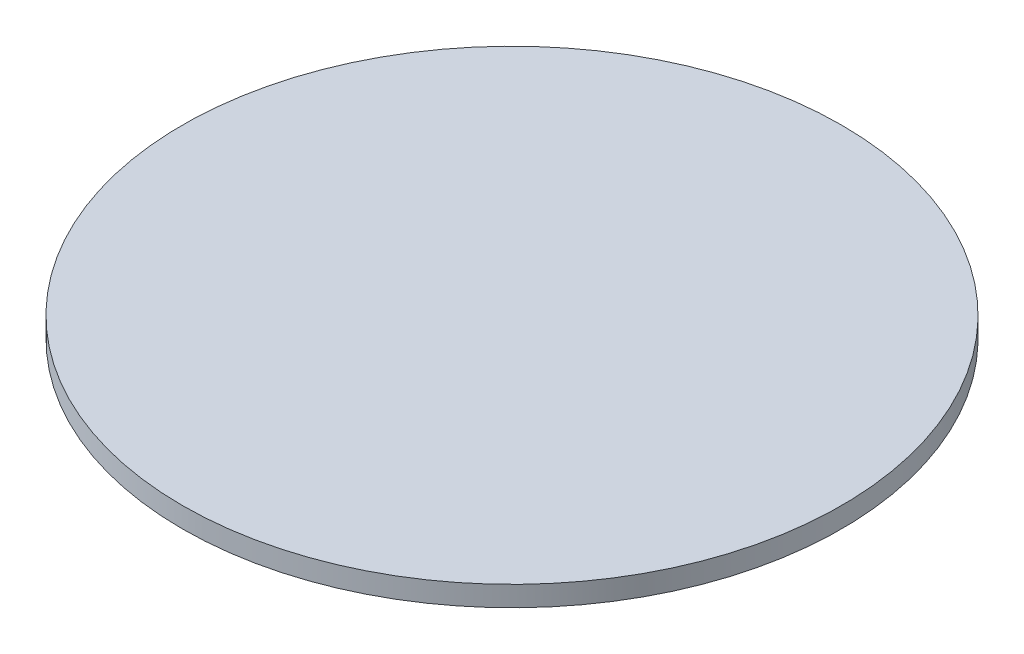
ISO-10303-21;
HEADER;
FILE_DESCRIPTION(('STEP AP214'),'2;1');
FILE_NAME('part.step','',(''),(''),'','','');
FILE_SCHEMA(('AUTOMOTIVE_DESIGN { 1 0 10303 214 1 1 1 1 }'));
ENDSEC;
DATA;
#1=APPLICATION_CONTEXT('core data for automotive mechanical design processes');
#2=APPLICATION_PROTOCOL_DEFINITION('international standard','automotive_design',2000,#1);
#3=PRODUCT_CONTEXT('',#1,'mechanical');
#4=PRODUCT('Part','Part','',(#3));
#5=PRODUCT_RELATED_PRODUCT_CATEGORY('part','',(#4));
#6=PRODUCT_DEFINITION_FORMATION('','',#4);
#7=PRODUCT_DEFINITION_CONTEXT('part definition',#1,'design');
#8=PRODUCT_DEFINITION('design','',#6,#7);
#9=PRODUCT_DEFINITION_SHAPE('','',#8);
#10=(LENGTH_UNIT() NAMED_UNIT(*) SI_UNIT(.MILLI.,.METRE.));
#11=(NAMED_UNIT(*) PLANE_ANGLE_UNIT() SI_UNIT($,.RADIAN.));
#12=(NAMED_UNIT(*) SI_UNIT($,.STERADIAN.) SOLID_ANGLE_UNIT());
#13=UNCERTAINTY_MEASURE_WITH_UNIT(LENGTH_MEASURE(1.E-05),#10,'distance_accuracy_value','');
#14=(GEOMETRIC_REPRESENTATION_CONTEXT(3) GLOBAL_UNCERTAINTY_ASSIGNED_CONTEXT((#13)) GLOBAL_UNIT_ASSIGNED_CONTEXT((#10,
#11,#12)) REPRESENTATION_CONTEXT('',''));
#15=CARTESIAN_POINT('',(0.,0.,0.));
#16=DIRECTION('',(0.,0.,1.));
#17=DIRECTION('',(1.,0.,0.));
#18=AXIS2_PLACEMENT_3D('',#15,#16,#17);
#19=CARTESIAN_POINT('',(0.,1.,0.));
#20=DIRECTION('',(0.,-1.,0.));
#21=DIRECTION('',(0.,0.,-1.));
#22=AXIS2_PLACEMENT_3D('',#19,#20,#21);
#23=CYLINDRICAL_SURFACE('',#22,16.25);
#24=CARTESIAN_POINT('',(0.,1.,0.));
#25=DIRECTION('',(0.,1.,0.));
#26=DIRECTION('',(0.,0.,1.));
#27=AXIS2_PLACEMENT_3D('',#24,#25,#26);
#28=CIRCLE('',#27,16.25);
#29=CARTESIAN_POINT('',(0.,1.,16.25));
#30=VERTEX_POINT('',#29);
#31=EDGE_CURVE('E10',#30,#30,#28,.T.);
#32=ORIENTED_EDGE('',*,*,#31,.F.);
#33=EDGE_LOOP('',(#32));
#34=FACE_BOUND('',#33,.T.);
#35=CARTESIAN_POINT('',(0.,0.,0.));
#36=DIRECTION('',(0.,1.,0.));
#37=DIRECTION('',(0.,0.,1.));
#38=AXIS2_PLACEMENT_3D('',#35,#36,#37);
#39=CIRCLE('',#38,16.25);
#40=CARTESIAN_POINT('',(0.,0.,16.25));
#41=VERTEX_POINT('',#40);
#42=EDGE_CURVE('E38',#41,#41,#39,.T.);
#43=ORIENTED_EDGE('',*,*,#42,.T.);
#44=EDGE_LOOP('',(#43));
#45=FACE_BOUND('',#44,.T.);
#46=ADVANCED_FACE('F35',(#34,#45),#23,.T.);
#47=CARTESIAN_POINT('',(0.,1.,0.));
#48=DIRECTION('',(0.,1.,0.));
#49=DIRECTION('',(0.,0.,1.));
#50=AXIS2_PLACEMENT_3D('',#47,#48,#49);
#51=PLANE('',#50);
#52=ORIENTED_EDGE('',*,*,#31,.T.);
#53=EDGE_LOOP('',(#52));
#54=FACE_BOUND('',#53,.T.);
#55=ADVANCED_FACE('F50',(#54),#51,.T.);
#56=CARTESIAN_POINT('',(0.,0.,0.));
#57=DIRECTION('',(0.,1.,0.));
#58=DIRECTION('',(0.,0.,1.));
#59=AXIS2_PLACEMENT_3D('',#56,#57,#58);
#60=PLANE('',#59);
#61=ORIENTED_EDGE('',*,*,#42,.F.);
#62=EDGE_LOOP('',(#61));
#63=FACE_BOUND('',#62,.T.);
#64=ADVANCED_FACE('F48',(#63),#60,.F.);
#65=CLOSED_SHELL('',(#46,#55,#64));
#66=MANIFOLD_SOLID_BREP('B2',#65);
#67=ADVANCED_BREP_SHAPE_REPRESENTATION('',(#18,#66),#14);
#68=SHAPE_DEFINITION_REPRESENTATION(#9,#67);
ENDSEC;
END-ISO-10303-21;
